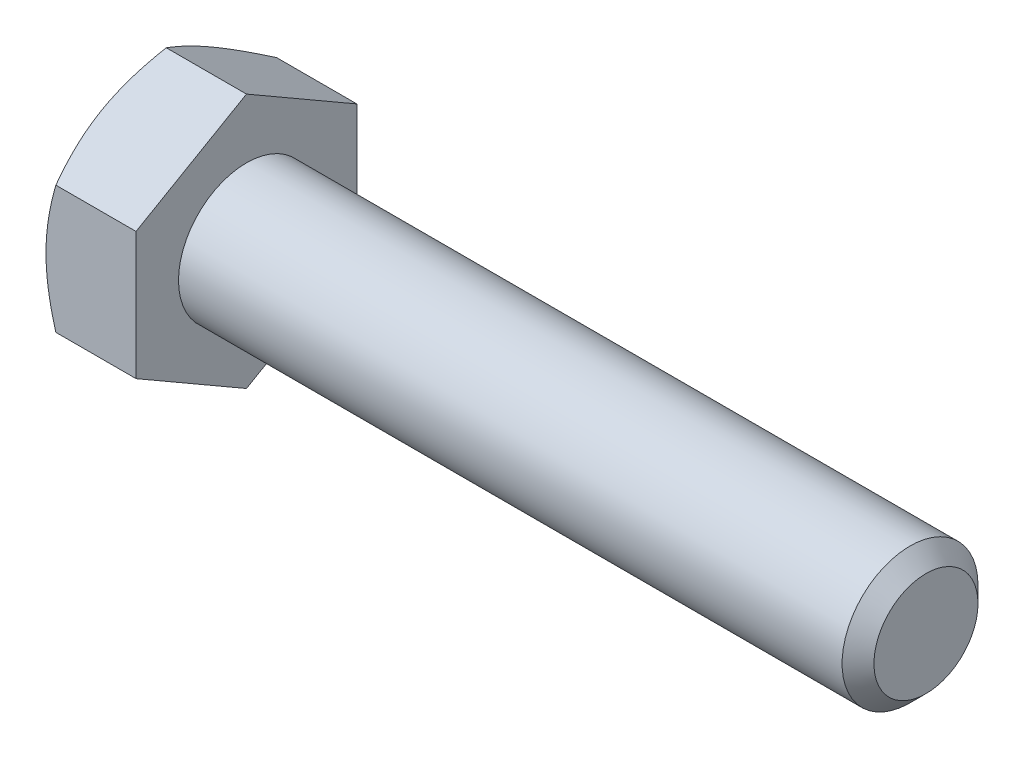
ISO-10303-21;
HEADER;
FILE_DESCRIPTION(('STEP AP214'),'2;1');
FILE_NAME('part.step','',(''),(''),'','','');
FILE_SCHEMA(('AUTOMOTIVE_DESIGN { 1 0 10303 214 1 1 1 1 }'));
ENDSEC;
DATA;
#1=APPLICATION_CONTEXT('core data for automotive mechanical design processes');
#2=APPLICATION_PROTOCOL_DEFINITION('international standard','automotive_design',2000,#1);
#3=PRODUCT_CONTEXT('',#1,'mechanical');
#4=PRODUCT('Part','Part','',(#3));
#5=PRODUCT_RELATED_PRODUCT_CATEGORY('part','',(#4));
#6=PRODUCT_DEFINITION_FORMATION('','',#4);
#7=PRODUCT_DEFINITION_CONTEXT('part definition',#1,'design');
#8=PRODUCT_DEFINITION('design','',#6,#7);
#9=PRODUCT_DEFINITION_SHAPE('','',#8);
#10=(LENGTH_UNIT() NAMED_UNIT(*) SI_UNIT(.MILLI.,.METRE.));
#11=(NAMED_UNIT(*) PLANE_ANGLE_UNIT() SI_UNIT($,.RADIAN.));
#12=(NAMED_UNIT(*) SI_UNIT($,.STERADIAN.) SOLID_ANGLE_UNIT());
#13=UNCERTAINTY_MEASURE_WITH_UNIT(LENGTH_MEASURE(1.E-05),#10,'distance_accuracy_value','');
#14=(GEOMETRIC_REPRESENTATION_CONTEXT(3) GLOBAL_UNCERTAINTY_ASSIGNED_CONTEXT((#13)) GLOBAL_UNIT_ASSIGNED_CONTEXT((#10,
#11,#12)) REPRESENTATION_CONTEXT('',''));
#15=CARTESIAN_POINT('',(0.,0.,0.));
#16=DIRECTION('',(0.,0.,1.));
#17=DIRECTION('',(1.,0.,0.));
#18=AXIS2_PLACEMENT_3D('',#15,#16,#17);
#19=CARTESIAN_POINT('',(-22.65,3.75277674973257,-6.5));
#20=DIRECTION('',(0.,0.,1.));
#21=DIRECTION('',(0.,-1.,0.));
#22=AXIS2_PLACEMENT_3D('',#19,#20,#21);
#23=PLANE('',#22);
#24=CARTESIAN_POINT('',(-19.3988375347904,-10.2428264448742,-6.5));
#25=CARTESIAN_POINT('',(-19.5378959568298,-9.9574912391405,-6.5));
#26=CARTESIAN_POINT('',(-19.6756670766775,-9.67151814089466,-6.5));
#27=CARTESIAN_POINT('',(-19.9479137007926,-9.09795746903657,-6.5));
#28=CARTESIAN_POINT('',(-20.0823887155004,-8.81036966330044,-6.5));
#29=CARTESIAN_POINT('',(-20.3479641385984,-8.23183597545904,-6.5));
#30=CARTESIAN_POINT('',(-20.4790435500319,-7.94088042259018,-6.5));
#31=CARTESIAN_POINT('',(-20.7360498001633,-7.35671087199065,-6.5));
#32=CARTESIAN_POINT('',(-20.8619768720535,-7.06349697718674,-6.5));
#33=CARTESIAN_POINT('',(-21.1114858396513,-6.4643492082911,-6.5));
#34=CARTESIAN_POINT('',(-21.2348431675994,-6.15832132148371,-6.5));
#35=CARTESIAN_POINT('',(-21.472608752086,-5.54274557657454,-6.5));
#36=CARTESIAN_POINT('',(-21.5870160276455,-5.23319733686813,-6.5));
#37=CARTESIAN_POINT('',(-21.8039973091502,-4.61061796093426,-6.5));
#38=CARTESIAN_POINT('',(-21.9065939138988,-4.29759477651376,-6.5));
#39=CARTESIAN_POINT('',(-22.0967687655389,-3.66705774167675,-6.5));
#40=CARTESIAN_POINT('',(-22.1843515728703,-3.34954528670966,-6.5));
#41=CARTESIAN_POINT('',(-22.3399427735025,-2.7116231594821,-6.5));
#42=CARTESIAN_POINT('',(-22.4080609404154,-2.39124068505769,-6.5));
#43=CARTESIAN_POINT('',(-22.5209643239007,-1.74628166899206,-6.5));
#44=CARTESIAN_POINT('',(-22.5657520879383,-1.4217055892218,-6.5));
#45=CARTESIAN_POINT('',(-22.6124703115096,-0.935153679865167,-6.5));
#46=CARTESIAN_POINT('',(-22.6246175505238,-0.774120709459425,-6.5));
#47=CARTESIAN_POINT('',(-22.6420902736854,-0.45167794746219,-6.5));
#48=CARTESIAN_POINT('',(-22.6474158757718,-0.290268162433767,-6.5));
#49=CARTESIAN_POINT('',(-22.6511103242405,0.0326315494834258,-6.5));
#50=CARTESIAN_POINT('',(-22.6494791334757,0.194121476795526,-6.5));
#51=CARTESIAN_POINT('',(-22.6393035354648,0.516885665892432,-6.5));
#52=CARTESIAN_POINT('',(-22.6307588135452,0.678159917525945,-6.5));
#53=CARTESIAN_POINT('',(-22.6024625394136,1.06087214104236,-6.5));
#54=CARTESIAN_POINT('',(-22.5797022251754,1.28209274970583,-6.5));
#55=CARTESIAN_POINT('',(-22.5223779071898,1.72298724409095,-6.5));
#56=CARTESIAN_POINT('',(-22.4878124366177,1.94266093413999,-6.5));
#57=CARTESIAN_POINT('',(-22.3682333769037,2.59905068849274,-6.5));
#58=CARTESIAN_POINT('',(-22.2673552447204,3.03292018726935,-6.5));
#59=CARTESIAN_POINT('',(-22.0911776385598,3.68203059846041,-6.5));
#60=CARTESIAN_POINT('',(-22.0274324340808,3.90060192791517,-6.5));
#61=CARTESIAN_POINT('',(-21.8930131704256,4.33562456943627,-6.5));
#62=CARTESIAN_POINT('',(-21.8223390575691,4.55207586506381,-6.5));
#63=CARTESIAN_POINT('',(-21.6752213498623,4.98292314894178,-6.5));
#64=CARTESIAN_POINT('',(-21.5987793659087,5.19731969234533,-6.5));
#65=CARTESIAN_POINT('',(-21.441056055445,5.62431367555164,-6.5));
#66=CARTESIAN_POINT('',(-21.3597748415996,5.83691115710785,-6.5));
#67=CARTESIAN_POINT('',(-21.1339612470781,6.41107024223243,-6.5));
#68=CARTESIAN_POINT('',(-20.9855374016011,6.77109993936459,-6.5));
#69=CARTESIAN_POINT('',(-20.6799136760887,7.48742894276139,-6.5));
#70=CARTESIAN_POINT('',(-20.5227128050824,7.84372782238264,-6.5));
#71=CARTESIAN_POINT('',(-20.2016207293392,8.55345570158046,-6.5));
#72=CARTESIAN_POINT('',(-20.0377269335731,8.90688352497397,-6.5));
#73=CARTESIAN_POINT('',(-19.704856755394,9.61131133342873,-6.5));
#74=CARTESIAN_POINT('',(-19.5358805841306,9.96231141860832,-6.5));
#75=CARTESIAN_POINT('',(-19.1936782330391,10.662937159309,-6.5));
#76=CARTESIAN_POINT('',(-19.0204455845689,11.012559648688,-6.5));
#77=CARTESIAN_POINT('',(-18.6708226067091,11.7102232163488,-6.5));
#78=CARTESIAN_POINT('',(-18.4944322504893,12.058264281162,-6.5));
#79=CARTESIAN_POINT('',(-18.1391563125904,12.7529700638115,-6.5));
#80=CARTESIAN_POINT('',(-17.9602713019335,13.099635074022,-6.5));
#81=CARTESIAN_POINT('',(-17.6004354194785,13.7918918665457,-6.5));
#82=CARTESIAN_POINT('',(-17.419484539364,14.1374836445314,-6.5));
#83=CARTESIAN_POINT('',(-16.9128202969977,15.099399814329,-6.5));
#84=CARTESIAN_POINT('',(-16.5852517304161,15.7147468097596,-6.5));
#85=CARTESIAN_POINT('',(-15.9261876636577,16.9433793144053,-6.5));
#86=CARTESIAN_POINT('',(-15.5946919178251,17.5566646915471,-6.5));
#87=CARTESIAN_POINT('',(-14.9299128254685,18.779571101851,-6.5));
#88=CARTESIAN_POINT('',(-14.5966393541487,19.3891975085091,-6.5));
#89=CARTESIAN_POINT('',(-13.9278601843398,20.6071616325274,-6.5));
#90=CARTESIAN_POINT('',(-13.5923546667948,21.2154994492026,-6.5));
#91=CARTESIAN_POINT('',(-13.2560387557676,21.8233856137376,-6.5));
#92=B_SPLINE_CURVE_WITH_KNOTS('',3,(#24,#25,#26,#27,#28,#29,#30,#31,#32,#33,#34,#35,#36,#37,#38,
#39,#40,#41,#42,#43,#44,#45,#46,#47,#48,#49,#50,#51,#52,#53,#54,#55,#56,#57,#58,#59,#60,#61,#62,
#63,#64,#65,#66,#67,#68,#69,#70,#71,#72,#73,#74,#75,#76,#77,#78,#79,#80,#81,#82,#83,#84,#85,#86,
#87,#88,#89,#90,#91),.UNSPECIFIED.,.F.,.F.,(4,2,2,2,2,2,2,2,2,2,2,2,2,2,2,2,2,2,2,2,2,2,2,2,2,2,
2,2,2,2,2,2,2,4),(0.,0.952261280954758,1.90466315142592,2.8619801174892,3.81925370781654,
4.80900961554029,5.79887385484699,6.78681142619052,7.77444837777728,8.75640022308114,
9.73824482580218,10.2225937503397,10.7069343008766,11.1912774376491,11.6756426208366,
12.3424346364353,13.0093095330214,14.3437044199063,15.0266742020637,15.7096492758005,
16.3924343039017,17.0752034419143,18.2433007736227,19.4115302572279,20.580216365918,
21.748853987895,22.9193933559163,24.0899426744252,25.2602283161706,26.4305186706516,
28.5218066724742,30.6132261881502,32.6975528607151,34.7817125747728),.UNSPECIFIED.);
#93=CARTESIAN_POINT('',(-22.0694434163992,3.75277674973257,-6.5));
#94=VERTEX_POINT('',#93);
#95=CARTESIAN_POINT('',(-22.65,0.,-6.5));
#96=VERTEX_POINT('',#95);
#97=EDGE_CURVE('E235',#94,#96,#92,.F.);
#98=ORIENTED_EDGE('',*,*,#97,.F.);
#99=DIRECTION('',(1.,0.,0.));
#100=VECTOR('',#99,1.);
#101=CARTESIAN_POINT('',(-22.65,3.75277674973257,-6.5));
#102=LINE('',#101,#100);
#103=CARTESIAN_POINT('',(-17.35,3.75277674973257,-6.5));
#104=VERTEX_POINT('',#103);
#105=EDGE_CURVE('E262',#94,#104,#102,.T.);
#106=ORIENTED_EDGE('',*,*,#105,.T.);
#107=DIRECTION('',(0.,-1.,0.));
#108=VECTOR('',#107,1.);
#109=CARTESIAN_POINT('',(-17.35,3.75277674973257,-6.5));
#110=LINE('',#109,#108);
#111=CARTESIAN_POINT('',(-17.35,-3.75277674973257,-6.5));
#112=VERTEX_POINT('',#111);
#113=EDGE_CURVE('E241',#104,#112,#110,.T.);
#114=ORIENTED_EDGE('',*,*,#113,.T.);
#115=DIRECTION('',(1.,0.,0.));
#116=VECTOR('',#115,1.);
#117=CARTESIAN_POINT('',(-22.65,-3.75277674973257,-6.5));
#118=LINE('',#117,#116);
#119=CARTESIAN_POINT('',(-22.0694434163992,-3.75277674973257,-6.5));
#120=VERTEX_POINT('',#119);
#121=EDGE_CURVE('E218',#120,#112,#118,.T.);
#122=ORIENTED_EDGE('',*,*,#121,.F.);
#123=EDGE_CURVE('E159',#96,#120,#92,.F.);
#124=ORIENTED_EDGE('',*,*,#123,.F.);
#125=EDGE_LOOP('',(#98,#106,#114,#122,#124));
#126=FACE_BOUND('',#125,.T.);
#127=ADVANCED_FACE('F35',(#126),#23,.F.);
#128=CARTESIAN_POINT('',(-22.65,-3.75277674973257,-6.5));
#129=DIRECTION('',(0.,0.866025403784439,0.5));
#130=DIRECTION('',(0.,-0.5,0.866025403784439));
#131=AXIS2_PLACEMENT_3D('',#128,#129,#130);
#132=PLANE('',#131);
#133=CARTESIAN_POINT('',(-22.0693767481941,-3.75266127967873,-6.5002));
#134=CARTESIAN_POINT('',(-22.1169955769245,-3.83515161912751,-6.35732254094112));
#135=CARTESIAN_POINT('',(-22.1624532993973,-3.91794952254313,-6.21391236546508));
#136=CARTESIAN_POINT('',(-22.248451317977,-4.08421773795795,-5.9259273686828));
#137=CARTESIAN_POINT('',(-22.288989492772,-4.16768832359106,-5.78135207342873));
#138=CARTESIAN_POINT('',(-22.4024289988768,-4.41943655294052,-5.34531134947996));
#139=CARTESIAN_POINT('',(-22.4669521928713,-4.5887079340369,-5.05212471715368));
#140=CARTESIAN_POINT('',(-22.5426134164525,-4.84201947708215,-4.61337625445562));
#141=CARTESIAN_POINT('',(-22.564167143543,-4.92530276780316,-4.46912536350531));
#142=CARTESIAN_POINT('',(-22.6003096853939,-5.09224566542477,-4.17997178286191));
#143=CARTESIAN_POINT('',(-22.6148991155403,-5.17590523841628,-4.03506915190111));
#144=CARTESIAN_POINT('',(-22.6367412474927,-5.34336968579964,-3.74501222057168));
#145=CARTESIAN_POINT('',(-22.6440022756779,-5.427174286676,-3.59985839394579));
#146=CARTESIAN_POINT('',(-22.6510396974178,-5.59485627940484,-3.30942466302505));
#147=CARTESIAN_POINT('',(-22.6508163221878,-5.6787336689286,-3.16414476276364));
#148=CARTESIAN_POINT('',(-22.6399165414848,-5.90853103021317,-2.7661240575735));
#149=CARTESIAN_POINT('',(-22.6216181821306,-6.05437578112764,-2.51351353897242));
#150=CARTESIAN_POINT('',(-22.5635936585423,-6.34509659313135,-2.00997032176432));
#151=CARTESIAN_POINT('',(-22.5238476614618,-6.48997163178545,-1.75903939406691));
#152=CARTESIAN_POINT('',(-22.4244940967978,-6.78127752911039,-1.25448277935567));
#153=CARTESIAN_POINT('',(-22.364465574362,-6.92767163007068,-1.00092075856408));
#154=CARTESIAN_POINT('',(-22.2282250074901,-7.21827667013277,-0.497578064240951));
#155=CARTESIAN_POINT('',(-22.1520449658364,-7.36249133098589,-0.247790944447032));
#156=CARTESIAN_POINT('',(-22.0693767481941,-7.50566896951897,0.000200000000003903));
#157=B_SPLINE_CURVE_WITH_KNOTS('',3,(#133,#134,#135,#136,#137,#138,#139,#140,#141,#142,#143,
#144,#145,#146,#147,#148,#149,#150,#151,#152,#153,#154,#155,#156),.UNSPECIFIED.,.F.,.F.,(4,2,2,
2,2,2,2,2,2,2,2,4),(0.,0.515105052395588,1.03043143507525,2.06322554824262,2.56697389547996,
3.07067772176454,3.57380860368928,4.0769239424252,4.9527935470566,5.82947446853466,
6.72559912449736,7.61996451221046),.UNSPECIFIED.);
#158=CARTESIAN_POINT('',(-22.65,-5.62916512459885,-3.25));
#159=VERTEX_POINT('',#158);
#160=EDGE_CURVE('E240',#120,#159,#157,.T.);
#161=ORIENTED_EDGE('',*,*,#160,.F.);
#162=ORIENTED_EDGE('',*,*,#121,.T.);
#163=DIRECTION('',(0.,-0.5,0.866025403784439));
#164=VECTOR('',#163,1.);
#165=CARTESIAN_POINT('',(-17.35,-3.75277674973257,-6.5));
#166=LINE('',#165,#164);
#167=CARTESIAN_POINT('',(-17.35,-7.50555349946514,0.));
#168=VERTEX_POINT('',#167);
#169=EDGE_CURVE('E272',#112,#168,#166,.T.);
#170=ORIENTED_EDGE('',*,*,#169,.T.);
#171=DIRECTION('',(1.,0.,0.));
#172=VECTOR('',#171,1.);
#173=CARTESIAN_POINT('',(-22.65,-7.50555349946514,0.));
#174=LINE('',#173,#172);
#175=CARTESIAN_POINT('',(-22.0694434163992,-7.50555349946514,0.));
#176=VERTEX_POINT('',#175);
#177=EDGE_CURVE('E222',#176,#168,#174,.T.);
#178=ORIENTED_EDGE('',*,*,#177,.F.);
#179=EDGE_CURVE('E178',#159,#176,#157,.T.);
#180=ORIENTED_EDGE('',*,*,#179,.F.);
#181=EDGE_LOOP('',(#161,#162,#170,#178,#180));
#182=FACE_BOUND('',#181,.T.);
#183=ADVANCED_FACE('F188',(#182),#132,.F.);
#184=CARTESIAN_POINT('',(-22.65,-7.50555349946514,0.));
#185=DIRECTION('',(0.,0.866025403784438,-0.5));
#186=DIRECTION('',(0.,0.5,0.866025403784439));
#187=AXIS2_PLACEMENT_3D('',#184,#185,#186);
#188=PLANE('',#187);
#189=CARTESIAN_POINT('',(-22.0693767481941,-7.50566896951897,-0.000199999999996426));
#190=CARTESIAN_POINT('',(-22.1169955769245,-7.4231786300702,0.142677459058884));
#191=CARTESIAN_POINT('',(-22.1624532993973,-7.34038072665458,0.286087634534916));
#192=CARTESIAN_POINT('',(-22.248451317977,-7.17411251123976,0.574072631317198));
#193=CARTESIAN_POINT('',(-22.288989492772,-7.09064192560665,0.718647926571267));
#194=CARTESIAN_POINT('',(-22.4024289988768,-6.83889369625719,1.15468865052004));
#195=CARTESIAN_POINT('',(-22.4669521928713,-6.66962231516081,1.44787528284632));
#196=CARTESIAN_POINT('',(-22.5426134164525,-6.41631077211555,1.88662374554438));
#197=CARTESIAN_POINT('',(-22.564167143543,-6.33302748139454,2.03087463649469));
#198=CARTESIAN_POINT('',(-22.6003096853939,-6.16608458377293,2.32002821713809));
#199=CARTESIAN_POINT('',(-22.6148991155403,-6.08242501078143,2.46493084809889));
#200=CARTESIAN_POINT('',(-22.6367412474927,-5.91496056339806,2.75498777942832));
#201=CARTESIAN_POINT('',(-22.6440022756779,-5.8311559625217,2.90014160605421));
#202=CARTESIAN_POINT('',(-22.6510396974178,-5.66347396979287,3.19057533697495));
#203=CARTESIAN_POINT('',(-22.6508163221878,-5.5795965802691,3.33585523723636));
#204=CARTESIAN_POINT('',(-22.6399165414848,-5.34979921898453,3.7338759424265));
#205=CARTESIAN_POINT('',(-22.6216181821306,-5.20395446807007,3.98648646102757));
#206=CARTESIAN_POINT('',(-22.5635936585423,-4.91323365606635,4.49002967823568));
#207=CARTESIAN_POINT('',(-22.5238476614618,-4.76835861741226,4.74096060593309));
#208=CARTESIAN_POINT('',(-22.4244940967978,-4.47705272008732,5.24551722064432));
#209=CARTESIAN_POINT('',(-22.364465574362,-4.33065861912703,5.49907924143592));
#210=CARTESIAN_POINT('',(-22.2282250074901,-4.04005357906494,6.00242193575905));
#211=CARTESIAN_POINT('',(-22.1520449658364,-3.89583891821181,6.25220905555297));
#212=CARTESIAN_POINT('',(-22.0693767481941,-3.75266127967873,6.5002));
#213=B_SPLINE_CURVE_WITH_KNOTS('',3,(#189,#190,#191,#192,#193,#194,#195,#196,#197,#198,#199,
#200,#201,#202,#203,#204,#205,#206,#207,#208,#209,#210,#211,#212),.UNSPECIFIED.,.F.,.F.,(4,2,2,
2,2,2,2,2,2,2,2,4),(0.,0.515105052395588,1.03043143507525,2.06322554824262,2.56697389547996,
3.07067772176454,3.57380860368928,4.0769239424252,4.9527935470566,5.82947446853466,
6.72559912449736,7.61996451221046),.UNSPECIFIED.);
#214=CARTESIAN_POINT('',(-22.65,-5.62916512459885,3.25));
#215=VERTEX_POINT('',#214);
#216=EDGE_CURVE('E176',#176,#215,#213,.T.);
#217=ORIENTED_EDGE('',*,*,#216,.F.);
#218=ORIENTED_EDGE('',*,*,#177,.T.);
#219=DIRECTION('',(0.,0.5,0.866025403784438));
#220=VECTOR('',#219,1.);
#221=CARTESIAN_POINT('',(-17.35,-7.50555349946514,0.));
#222=LINE('',#221,#220);
#223=CARTESIAN_POINT('',(-17.35,-3.75277674973257,6.5));
#224=VERTEX_POINT('',#223);
#225=EDGE_CURVE('E255',#168,#224,#222,.T.);
#226=ORIENTED_EDGE('',*,*,#225,.T.);
#227=DIRECTION('',(1.,0.,0.));
#228=VECTOR('',#227,1.);
#229=CARTESIAN_POINT('',(-22.65,-3.75277674973257,6.5));
#230=LINE('',#229,#228);
#231=CARTESIAN_POINT('',(-22.0694434163994,-3.75277674973285,6.5));
#232=VERTEX_POINT('',#231);
#233=EDGE_CURVE('E252',#232,#224,#230,.T.);
#234=ORIENTED_EDGE('',*,*,#233,.F.);
#235=EDGE_CURVE('E170',#215,#232,#213,.T.);
#236=ORIENTED_EDGE('',*,*,#235,.F.);
#237=EDGE_LOOP('',(#217,#218,#226,#234,#236));
#238=FACE_BOUND('',#237,.T.);
#239=ADVANCED_FACE('F184',(#238),#188,.F.);
#240=CARTESIAN_POINT('',(-22.65,-3.75277674973257,6.5));
#241=DIRECTION('',(0.,0.,-1.));
#242=DIRECTION('',(0.,1.,0.));
#243=AXIS2_PLACEMENT_3D('',#240,#241,#242);
#244=PLANE('',#243);
#245=CARTESIAN_POINT('',(-19.398837531364,-10.242826451903,6.50000000000001));
#246=CARTESIAN_POINT('',(-19.5378959535461,-9.9574912459326,6.50000000000001));
#247=CARTESIAN_POINT('',(-19.6756670735365,-9.67151814744991,6.50000000000001));
#248=CARTESIAN_POINT('',(-19.9479136979362,-9.09795747511739,6.50000000000001));
#249=CARTESIAN_POINT('',(-20.082388712786,-8.81036966914369,6.5));
#250=CARTESIAN_POINT('',(-20.3479641361679,-8.2318359808236,6.5));
#251=CARTESIAN_POINT('',(-20.4790435477435,-7.9408804277136,6.5));
#252=CARTESIAN_POINT('',(-20.7360497981565,-7.35671087663017,6.5));
#253=CARTESIAN_POINT('',(-20.8619768701864,-7.0634969815835,6.5));
#254=CARTESIAN_POINT('',(-21.1114858380679,-6.46434921218302,6.5));
#255=CARTESIAN_POINT('',(-21.2348431661597,-6.15832132511338,6.5));
#256=CARTESIAN_POINT('',(-21.472608750926,-5.54274557967553,6.5));
#257=CARTESIAN_POINT('',(-21.5870160266216,-5.23319733970269,6.5));
#258=CARTESIAN_POINT('',(-21.8039973083856,-4.61061796323105,6.5));
#259=CARTESIAN_POINT('',(-21.9065939132575,-4.29759477853923,6.5));
#260=CARTESIAN_POINT('',(-22.0967687651243,-3.6670577431522,6.5));
#261=CARTESIAN_POINT('',(-22.1843515725591,-3.34954528790644,6.5));
#262=CARTESIAN_POINT('',(-22.3399427734003,-2.71162315998016,6.5));
#263=CARTESIAN_POINT('',(-22.4080609404108,-2.39124068513379,6.5));
#264=CARTESIAN_POINT('',(-22.5209643240282,-1.74628166821368,6.5));
#265=CARTESIAN_POINT('',(-22.5657520881001,-1.4217055880109,6.5));
#266=CARTESIAN_POINT('',(-22.6124703116654,-0.935153678008444,6.5));
#267=CARTESIAN_POINT('',(-22.6246175506682,-0.774120707390584,6.5));
#268=CARTESIAN_POINT('',(-22.6420902737883,-0.451677944969427,6.5));
#269=CARTESIAN_POINT('',(-22.6474158758445,-0.290268159729199,6.5));
#270=CARTESIAN_POINT('',(-22.6511103242345,0.0326315526100629,6.5));
#271=CARTESIAN_POINT('',(-22.6494791334211,0.194121480132428,6.5));
#272=CARTESIAN_POINT('',(-22.6393035352959,0.516885669647165,6.5));
#273=CARTESIAN_POINT('',(-22.6307588133104,0.678159921488244,6.5));
#274=CARTESIAN_POINT('',(-22.6024625390171,1.06087214532241,6.5));
#275=CARTESIAN_POINT('',(-22.5797022246861,1.28209275409517,6.5));
#276=CARTESIAN_POINT('',(-22.5223779065098,1.72298724869384,6.5));
#277=CARTESIAN_POINT('',(-22.48781243584,1.94266093884715,6.5));
#278=CARTESIAN_POINT('',(-22.3682333758306,2.59905069350689,6.5));
#279=CARTESIAN_POINT('',(-22.2673552434479,3.03292019247994,6.5));
#280=CARTESIAN_POINT('',(-22.0911776369932,3.68203060396479,6.5));
#281=CARTESIAN_POINT('',(-22.0274324324155,3.90060193351964,6.5));
#282=CARTESIAN_POINT('',(-21.893013168566,4.33562457523974,6.5));
#283=CARTESIAN_POINT('',(-21.8223390556138,4.55207587096621,6.5));
#284=CARTESIAN_POINT('',(-21.6752213477193,4.98292315504126,6.5));
#285=CARTESIAN_POINT('',(-21.5987793636737,5.19731969854297,6.5));
#286=CARTESIAN_POINT('',(-21.441056053029,5.62431368194561,6.5));
#287=CARTESIAN_POINT('',(-21.3597748390948,5.83691116359999,6.5));
#288=CARTESIAN_POINT('',(-21.1339612444198,6.41107024877938,6.5));
#289=CARTESIAN_POINT('',(-20.985537398888,6.77109994587116,6.5));
#290=CARTESIAN_POINT('',(-20.679913673282,7.48742894919242,6.5));
#291=CARTESIAN_POINT('',(-20.5227128022369,7.84372782877852,6.5));
#292=CARTESIAN_POINT('',(-20.2016207264276,8.55345570790977,6.5));
#293=CARTESIAN_POINT('',(-20.0377269306343,8.90688353127189,6.5));
#294=CARTESIAN_POINT('',(-19.7048567524088,9.61131133966725,6.5));
#295=CARTESIAN_POINT('',(-19.5358805811264,9.96231142481885,6.5));
#296=CARTESIAN_POINT('',(-19.1936782300035,10.6629371654643,6.5));
#297=CARTESIAN_POINT('',(-19.0204455815211,11.0125596548161,6.5));
#298=CARTESIAN_POINT('',(-18.6708226036412,11.7102232224246,6.5));
#299=CARTESIAN_POINT('',(-18.4944322474136,12.0582642872127,6.5));
#300=CARTESIAN_POINT('',(-18.1391563095022,12.7529700698137,6.5));
#301=CARTESIAN_POINT('',(-17.9602712988407,13.0996350800009,6.5));
#302=CARTESIAN_POINT('',(-17.6004354163791,13.7918918724793,6.5));
#303=CARTESIAN_POINT('',(-17.4194845362626,14.137483650443,6.5));
#304=CARTESIAN_POINT('',(-16.9128202938739,15.0993998202175,6.5));
#305=CARTESIAN_POINT('',(-16.5852517272737,15.7147468156481,6.5));
#306=CARTESIAN_POINT('',(-15.9261876604819,16.9433793202954,6.5));
#307=CARTESIAN_POINT('',(-15.5946919146346,17.5566646974389,6.5));
#308=CARTESIAN_POINT('',(-14.9299128222475,18.7795711077538,6.5));
#309=CARTESIAN_POINT('',(-14.5966393509119,19.3891975144212,6.5));
#310=CARTESIAN_POINT('',(-13.9278601810733,20.6071616384594,6.5));
#311=CARTESIAN_POINT('',(-13.5923546635142,21.215499455145,6.5));
#312=CARTESIAN_POINT('',(-13.2560387524736,21.8233856196907,6.5));
#313=B_SPLINE_CURVE_WITH_KNOTS('',3,(#245,#246,#247,#248,#249,#250,#251,#252,#253,#254,#255,
#256,#257,#258,#259,#260,#261,#262,#263,#264,#265,#266,#267,#268,#269,#270,#271,#272,#273,#274,
#275,#276,#277,#278,#279,#280,#281,#282,#283,#284,#285,#286,#287,#288,#289,#290,#291,#292,#293,
#294,#295,#296,#297,#298,#299,#300,#301,#302,#303,#304,#305,#306,#307,#308,#309,#310,#311,#312),
.UNSPECIFIED.,.F.,.F.,(4,2,2,2,2,2,2,2,2,2,2,2,2,2,2,2,2,2,2,2,2,2,2,2,2,2,2,2,2,2,2,2,2,4),(0.,
0.952261281780652,1.90466315307783,2.86198011997567,3.81925371113752,4.80900961975204,
5.79887385994981,6.78681143218155,7.77444838465583,8.75640023125628,9.73824483527201,
10.222593760441,10.7069343116093,11.1912774490135,11.6756426328327,12.3424346487859,
13.0093095457265,14.343704433322,15.0266742158507,15.7096492899588,16.3924343184303,
17.0752034568132,18.2433007884729,19.4115302720289,20.5802163806681,21.7488540025943,
22.9193933705589,24.0899426890111,25.2602283307008,26.4305186851261,28.5218066869747,
30.6132262026763,32.6975528752884,34.7817125893938),.UNSPECIFIED.);
#314=CARTESIAN_POINT('',(-22.65,0.,6.5));
#315=VERTEX_POINT('',#314);
#316=EDGE_CURVE('E177',#232,#315,#313,.T.);
#317=ORIENTED_EDGE('',*,*,#316,.F.);
#318=ORIENTED_EDGE('',*,*,#233,.T.);
#319=DIRECTION('',(0.,1.,0.));
#320=VECTOR('',#319,1.);
#321=CARTESIAN_POINT('',(-17.35,-3.75277674973257,6.5));
#322=LINE('',#321,#320);
#323=CARTESIAN_POINT('',(-17.35,3.75277674973257,6.5));
#324=VERTEX_POINT('',#323);
#325=EDGE_CURVE('E269',#224,#324,#322,.T.);
#326=ORIENTED_EDGE('',*,*,#325,.T.);
#327=DIRECTION('',(1.,0.,0.));
#328=VECTOR('',#327,1.);
#329=CARTESIAN_POINT('',(-22.65,3.75277674973257,6.5));
#330=LINE('',#329,#328);
#331=CARTESIAN_POINT('',(-22.0694434163992,3.75277674973257,6.5));
#332=VERTEX_POINT('',#331);
#333=EDGE_CURVE('E257',#332,#324,#330,.T.);
#334=ORIENTED_EDGE('',*,*,#333,.F.);
#335=EDGE_CURVE('E107',#315,#332,#313,.T.);
#336=ORIENTED_EDGE('',*,*,#335,.F.);
#337=EDGE_LOOP('',(#317,#318,#326,#334,#336));
#338=FACE_BOUND('',#337,.T.);
#339=ADVANCED_FACE('F187',(#338),#244,.F.);
#340=CARTESIAN_POINT('',(-22.65,3.75277674973257,6.5));
#341=DIRECTION('',(0.,-0.866025403784439,-0.5));
#342=DIRECTION('',(0.,0.5,-0.866025403784439));
#343=AXIS2_PLACEMENT_3D('',#340,#341,#342);
#344=PLANE('',#343);
#345=CARTESIAN_POINT('',(-22.0693767481941,3.75266127967873,6.5002));
#346=CARTESIAN_POINT('',(-22.1169955769245,3.83515161912751,6.35732254094112));
#347=CARTESIAN_POINT('',(-22.1624532993973,3.91794952254312,6.21391236546509));
#348=CARTESIAN_POINT('',(-22.248451317977,4.08421773795795,5.92592736868281));
#349=CARTESIAN_POINT('',(-22.288989492772,4.16768832359106,5.78135207342874));
#350=CARTESIAN_POINT('',(-22.4024289988768,4.41943655294052,5.34531134947997));
#351=CARTESIAN_POINT('',(-22.4669521928713,4.5887079340369,5.05212471715368));
#352=CARTESIAN_POINT('',(-22.5426134164525,4.84201947708215,4.61337625445563));
#353=CARTESIAN_POINT('',(-22.564167143543,4.92530276780316,4.46912536350531));
#354=CARTESIAN_POINT('',(-22.6003096853939,5.09224566542477,4.17997178286191));
#355=CARTESIAN_POINT('',(-22.6148991155403,5.17590523841628,4.03506915190111));
#356=CARTESIAN_POINT('',(-22.6367412474927,5.34336968579964,3.74501222057168));
#357=CARTESIAN_POINT('',(-22.6440022756779,5.427174286676,3.59985839394579));
#358=CARTESIAN_POINT('',(-22.6510396974178,5.59485627940484,3.30942466302505));
#359=CARTESIAN_POINT('',(-22.6508163221878,5.6787336689286,3.16414476276364));
#360=CARTESIAN_POINT('',(-22.6399165414848,5.90853103021317,2.76612405757351));
#361=CARTESIAN_POINT('',(-22.6216181821306,6.05437578112763,2.51351353897243));
#362=CARTESIAN_POINT('',(-22.5635936585423,6.34509659313135,2.00997032176432));
#363=CARTESIAN_POINT('',(-22.5238476614618,6.48997163178545,1.75903939406692));
#364=CARTESIAN_POINT('',(-22.4244940967978,6.78127752911039,1.25448277935568));
#365=CARTESIAN_POINT('',(-22.364465574362,6.92767163007068,1.00092075856409));
#366=CARTESIAN_POINT('',(-22.2282250074901,7.21827667013277,0.497578064240955));
#367=CARTESIAN_POINT('',(-22.1520449658364,7.36249133098589,0.247790944447035));
#368=CARTESIAN_POINT('',(-22.0693767481941,7.50566896951897,-0.000200000000000525));
#369=B_SPLINE_CURVE_WITH_KNOTS('',3,(#345,#346,#347,#348,#349,#350,#351,#352,#353,#354,#355,
#356,#357,#358,#359,#360,#361,#362,#363,#364,#365,#366,#367,#368),.UNSPECIFIED.,.F.,.F.,(4,2,2,
2,2,2,2,2,2,2,2,4),(0.,0.515105052395588,1.03043143507524,2.06322554824262,2.56697389547996,
3.07067772176454,3.57380860368928,4.0769239424252,4.9527935470566,5.82947446853466,
6.72559912449736,7.61996451221046),.UNSPECIFIED.);
#370=CARTESIAN_POINT('',(-22.65,5.62916512459885,3.25));
#371=VERTEX_POINT('',#370);
#372=EDGE_CURVE('E104',#332,#371,#369,.T.);
#373=ORIENTED_EDGE('',*,*,#372,.F.);
#374=ORIENTED_EDGE('',*,*,#333,.T.);
#375=DIRECTION('',(0.,0.5,-0.866025403784439));
#376=VECTOR('',#375,1.);
#377=CARTESIAN_POINT('',(-17.35,3.75277674973257,6.5));
#378=LINE('',#377,#376);
#379=CARTESIAN_POINT('',(-17.35,7.50555349946514,0.));
#380=VERTEX_POINT('',#379);
#381=EDGE_CURVE('E267',#324,#380,#378,.T.);
#382=ORIENTED_EDGE('',*,*,#381,.T.);
#383=DIRECTION('',(1.,0.,0.));
#384=VECTOR('',#383,1.);
#385=CARTESIAN_POINT('',(-22.65,7.50555349946514,0.));
#386=LINE('',#385,#384);
#387=CARTESIAN_POINT('',(-22.0694434163992,7.50555349946514,0.));
#388=VERTEX_POINT('',#387);
#389=EDGE_CURVE('E128',#388,#380,#386,.T.);
#390=ORIENTED_EDGE('',*,*,#389,.F.);
#391=EDGE_CURVE('E111',#371,#388,#369,.T.);
#392=ORIENTED_EDGE('',*,*,#391,.F.);
#393=EDGE_LOOP('',(#373,#374,#382,#390,#392));
#394=FACE_BOUND('',#393,.T.);
#395=ADVANCED_FACE('F126',(#394),#344,.F.);
#396=CARTESIAN_POINT('',(-22.65,7.50555349946514,0.));
#397=DIRECTION('',(0.,-0.866025403784439,0.5));
#398=DIRECTION('',(0.,-0.5,-0.866025403784439));
#399=AXIS2_PLACEMENT_3D('',#396,#397,#398);
#400=PLANE('',#399);
#401=CARTESIAN_POINT('',(-22.0693767481941,7.50566896951897,0.000199999999998974));
#402=CARTESIAN_POINT('',(-22.1169955769245,7.4231786300702,-0.142677459058882));
#403=CARTESIAN_POINT('',(-22.1624532993973,7.34038072665458,-0.286087634534914));
#404=CARTESIAN_POINT('',(-22.248451317977,7.17411251123976,-0.574072631317195));
#405=CARTESIAN_POINT('',(-22.288989492772,7.09064192560665,-0.718647926571265));
#406=CARTESIAN_POINT('',(-22.4024289988768,6.83889369625719,-1.15468865052003));
#407=CARTESIAN_POINT('',(-22.4669521928713,6.66962231516081,-1.44787528284632));
#408=CARTESIAN_POINT('',(-22.5426134164525,6.41631077211555,-1.88662374554437));
#409=CARTESIAN_POINT('',(-22.564167143543,6.33302748139454,-2.03087463649469));
#410=CARTESIAN_POINT('',(-22.6003096853939,6.16608458377293,-2.32002821713809));
#411=CARTESIAN_POINT('',(-22.6148991155403,6.08242501078143,-2.46493084809889));
#412=CARTESIAN_POINT('',(-22.6367412474927,5.91496056339807,-2.75498777942832));
#413=CARTESIAN_POINT('',(-22.6440022756779,5.8311559625217,-2.90014160605421));
#414=CARTESIAN_POINT('',(-22.6510396974178,5.66347396979287,-3.19057533697495));
#415=CARTESIAN_POINT('',(-22.6508163221878,5.5795965802691,-3.33585523723636));
#416=CARTESIAN_POINT('',(-22.6399165414848,5.34979921898453,-3.73387594242649));
#417=CARTESIAN_POINT('',(-22.6216181821306,5.20395446807007,-3.98648646102757));
#418=CARTESIAN_POINT('',(-22.5635936585423,4.91323365606636,-4.49002967823568));
#419=CARTESIAN_POINT('',(-22.5238476614618,4.76835861741226,-4.74096060593308));
#420=CARTESIAN_POINT('',(-22.4244940967978,4.47705272008732,-5.24551722064432));
#421=CARTESIAN_POINT('',(-22.364465574362,4.33065861912703,-5.49907924143591));
#422=CARTESIAN_POINT('',(-22.2282250074901,4.04005357906494,-6.00242193575904));
#423=CARTESIAN_POINT('',(-22.1520449658364,3.89583891821182,-6.25220905555296));
#424=CARTESIAN_POINT('',(-22.0693767481941,3.75266127967873,-6.5002));
#425=B_SPLINE_CURVE_WITH_KNOTS('',3,(#401,#402,#403,#404,#405,#406,#407,#408,#409,#410,#411,
#412,#413,#414,#415,#416,#417,#418,#419,#420,#421,#422,#423,#424),.UNSPECIFIED.,.F.,.F.,(4,2,2,
2,2,2,2,2,2,2,2,4),(0.,0.515105052395587,1.03043143507524,2.06322554824262,2.56697389547996,
3.07067772176454,3.57380860368928,4.0769239424252,4.9527935470566,5.82947446853466,
6.72559912449736,7.61996451221045),.UNSPECIFIED.);
#426=CARTESIAN_POINT('',(-22.65,5.62916512459885,-3.25));
#427=VERTEX_POINT('',#426);
#428=EDGE_CURVE('E117',#388,#427,#425,.T.);
#429=ORIENTED_EDGE('',*,*,#428,.F.);
#430=ORIENTED_EDGE('',*,*,#389,.T.);
#431=DIRECTION('',(0.,-0.5,-0.866025403784439));
#432=VECTOR('',#431,1.);
#433=CARTESIAN_POINT('',(-17.35,7.50555349946514,0.));
#434=LINE('',#433,#432);
#435=EDGE_CURVE('E264',#380,#104,#434,.T.);
#436=ORIENTED_EDGE('',*,*,#435,.T.);
#437=ORIENTED_EDGE('',*,*,#105,.F.);
#438=EDGE_CURVE('E123',#427,#94,#425,.T.);
#439=ORIENTED_EDGE('',*,*,#438,.F.);
#440=EDGE_LOOP('',(#429,#430,#436,#437,#439));
#441=FACE_BOUND('',#440,.T.);
#442=ADVANCED_FACE('F203',(#441),#400,.F.);
#443=CARTESIAN_POINT('',(-17.35,0.,0.));
#444=DIRECTION('',(1.,0.,0.));
#445=DIRECTION('',(0.,0.,-1.));
#446=AXIS2_PLACEMENT_3D('',#443,#444,#445);
#447=CYLINDRICAL_SURFACE('',#446,4.);
#448=CARTESIAN_POINT('',(21.7125,0.,0.));
#449=DIRECTION('',(1.,0.,0.));
#450=DIRECTION('',(0.,0.,-1.));
#451=AXIS2_PLACEMENT_3D('',#448,#449,#450);
#452=CIRCLE('',#451,4.);
#453=CARTESIAN_POINT('',(21.7125,0.,-4.));
#454=VERTEX_POINT('',#453);
#455=EDGE_CURVE('E212',#454,#454,#452,.F.);
#456=ORIENTED_EDGE('',*,*,#455,.T.);
#457=EDGE_LOOP('',(#456));
#458=FACE_BOUND('',#457,.T.);
#459=CARTESIAN_POINT('',(-17.35,0.,0.));
#460=DIRECTION('',(-1.,0.,0.));
#461=DIRECTION('',(0.,0.,1.));
#462=AXIS2_PLACEMENT_3D('',#459,#460,#461);
#463=CIRCLE('',#462,4.);
#464=CARTESIAN_POINT('',(-17.35,0.,4.));
#465=VERTEX_POINT('',#464);
#466=EDGE_CURVE('E215',#465,#465,#463,.F.);
#467=ORIENTED_EDGE('',*,*,#466,.T.);
#468=EDGE_LOOP('',(#467));
#469=FACE_BOUND('',#468,.T.);
#470=ADVANCED_FACE('F200',(#458,#469),#447,.T.);
#471=CARTESIAN_POINT('',(22.65,0.,0.));
#472=DIRECTION('',(1.,0.,0.));
#473=DIRECTION('',(0.,0.,-1.));
#474=AXIS2_PLACEMENT_3D('',#471,#472,#473);
#475=PLANE('',#474);
#476=CARTESIAN_POINT('',(22.65,0.,0.));
#477=DIRECTION('',(1.,0.,0.));
#478=DIRECTION('',(0.,0.,-1.));
#479=AXIS2_PLACEMENT_3D('',#476,#477,#478);
#480=CIRCLE('',#479,3.0625);
#481=CARTESIAN_POINT('',(22.65,0.,-3.0625));
#482=VERTEX_POINT('',#481);
#483=EDGE_CURVE('E217',#482,#482,#480,.T.);
#484=ORIENTED_EDGE('',*,*,#483,.T.);
#485=EDGE_LOOP('',(#484));
#486=FACE_BOUND('',#485,.T.);
#487=ADVANCED_FACE('F198',(#486),#475,.T.);
#488=CARTESIAN_POINT('',(22.65,0.,0.));
#489=DIRECTION('',(-1.,0.,0.));
#490=DIRECTION('',(0.,0.,1.));
#491=AXIS2_PLACEMENT_3D('',#488,#489,#490);
#492=CONICAL_SURFACE('',#491,3.0625,0.785398163397447);
#493=ORIENTED_EDGE('',*,*,#455,.F.);
#494=EDGE_LOOP('',(#493));
#495=FACE_BOUND('',#494,.T.);
#496=ORIENTED_EDGE('',*,*,#483,.F.);
#497=EDGE_LOOP('',(#496));
#498=FACE_BOUND('',#497,.T.);
#499=ADVANCED_FACE('F37',(#495,#498),#492,.T.);
#500=CARTESIAN_POINT('',(-17.35,-3.75277674973257,-6.5));
#501=DIRECTION('',(-1.,0.,0.));
#502=DIRECTION('',(0.,0.,1.));
#503=AXIS2_PLACEMENT_3D('',#500,#501,#502);
#504=PLANE('',#503);
#505=ORIENTED_EDGE('',*,*,#466,.F.);
#506=EDGE_LOOP('',(#505));
#507=FACE_BOUND('',#506,.T.);
#508=ORIENTED_EDGE('',*,*,#113,.F.);
#509=ORIENTED_EDGE('',*,*,#435,.F.);
#510=ORIENTED_EDGE('',*,*,#381,.F.);
#511=ORIENTED_EDGE('',*,*,#325,.F.);
#512=ORIENTED_EDGE('',*,*,#225,.F.);
#513=ORIENTED_EDGE('',*,*,#169,.F.);
#514=EDGE_LOOP('',(#508,#509,#510,#511,#512,#513));
#515=FACE_BOUND('',#514,.T.);
#516=ADVANCED_FACE('F278',(#507,#515),#504,.F.);
#517=CARTESIAN_POINT('',(-22.65,0.,0.));
#518=DIRECTION('',(1.,0.,0.));
#519=DIRECTION('',(0.,0.,1.));
#520=AXIS2_PLACEMENT_3D('',#517,#518,#519);
#521=CONICAL_SURFACE('',#520,6.5,1.0471975511966);
#522=ORIENTED_EDGE('',*,*,#235,.T.);
#523=ORIENTED_EDGE('',*,*,#316,.T.);
#524=CARTESIAN_POINT('',(-22.65,0.,0.));
#525=DIRECTION('',(-1.,0.,0.));
#526=DIRECTION('',(0.,0.,1.));
#527=AXIS2_PLACEMENT_3D('',#524,#525,#526);
#528=CIRCLE('',#527,6.5);
#529=EDGE_CURVE('E39',#215,#315,#528,.T.);
#530=ORIENTED_EDGE('',*,*,#529,.F.);
#531=EDGE_LOOP('',(#522,#523,#530));
#532=FACE_BOUND('',#531,.T.);
#533=ADVANCED_FACE('F247',(#532),#521,.T.);
#534=ORIENTED_EDGE('',*,*,#179,.T.);
#535=ORIENTED_EDGE('',*,*,#216,.T.);
#536=EDGE_CURVE('E225',#159,#215,#528,.T.);
#537=ORIENTED_EDGE('',*,*,#536,.F.);
#538=EDGE_LOOP('',(#534,#535,#537));
#539=FACE_BOUND('',#538,.T.);
#540=ADVANCED_FACE('F244',(#539),#521,.T.);
#541=ORIENTED_EDGE('',*,*,#123,.T.);
#542=ORIENTED_EDGE('',*,*,#160,.T.);
#543=EDGE_CURVE('E226',#96,#159,#528,.T.);
#544=ORIENTED_EDGE('',*,*,#543,.F.);
#545=EDGE_LOOP('',(#541,#542,#544));
#546=FACE_BOUND('',#545,.T.);
#547=ADVANCED_FACE('F153',(#546),#521,.T.);
#548=ORIENTED_EDGE('',*,*,#97,.T.);
#549=EDGE_CURVE('E44',#427,#96,#528,.T.);
#550=ORIENTED_EDGE('',*,*,#549,.F.);
#551=ORIENTED_EDGE('',*,*,#438,.T.);
#552=EDGE_LOOP('',(#548,#550,#551));
#553=FACE_BOUND('',#552,.T.);
#554=ADVANCED_FACE('F149',(#553),#521,.T.);
#555=ORIENTED_EDGE('',*,*,#391,.T.);
#556=ORIENTED_EDGE('',*,*,#428,.T.);
#557=EDGE_CURVE('E12',#371,#427,#528,.T.);
#558=ORIENTED_EDGE('',*,*,#557,.F.);
#559=EDGE_LOOP('',(#555,#556,#558));
#560=FACE_BOUND('',#559,.T.);
#561=ADVANCED_FACE('F115',(#560),#521,.T.);
#562=ORIENTED_EDGE('',*,*,#335,.T.);
#563=ORIENTED_EDGE('',*,*,#372,.T.);
#564=CARTESIAN_POINT('',(-22.65,0.,0.));
#565=DIRECTION('',(-1.,0.,0.));
#566=DIRECTION('',(0.,0.,1.));
#567=AXIS2_PLACEMENT_3D('',#564,#565,#566);
#568=CIRCLE('',#567,6.5);
#569=EDGE_CURVE('E51',#315,#371,#568,.T.);
#570=ORIENTED_EDGE('',*,*,#569,.F.);
#571=EDGE_LOOP('',(#562,#563,#570));
#572=FACE_BOUND('',#571,.T.);
#573=ADVANCED_FACE('F105',(#572),#521,.T.);
#574=CARTESIAN_POINT('',(-22.65,-3.75277674973257,-6.5));
#575=DIRECTION('',(-1.,0.,0.));
#576=DIRECTION('',(0.,0.,1.));
#577=AXIS2_PLACEMENT_3D('',#574,#575,#576);
#578=PLANE('',#577);
#579=ORIENTED_EDGE('',*,*,#529,.T.);
#580=ORIENTED_EDGE('',*,*,#569,.T.);
#581=ORIENTED_EDGE('',*,*,#557,.T.);
#582=ORIENTED_EDGE('',*,*,#549,.T.);
#583=ORIENTED_EDGE('',*,*,#543,.T.);
#584=ORIENTED_EDGE('',*,*,#536,.T.);
#585=EDGE_LOOP('',(#579,#580,#581,#582,#583,#584));
#586=FACE_BOUND('',#585,.T.);
#587=ADVANCED_FACE('F120',(#586),#578,.T.);
#588=CLOSED_SHELL('',(#127,#183,#239,#339,#395,#442,#470,#487,#499,#516,#533,#540,#547,#554,
#561,#573,#587));
#589=MANIFOLD_SOLID_BREP('B2',#588);
#590=ADVANCED_BREP_SHAPE_REPRESENTATION('',(#18,#589),#14);
#591=SHAPE_DEFINITION_REPRESENTATION(#9,#590);
ENDSEC;
END-ISO-10303-21;
